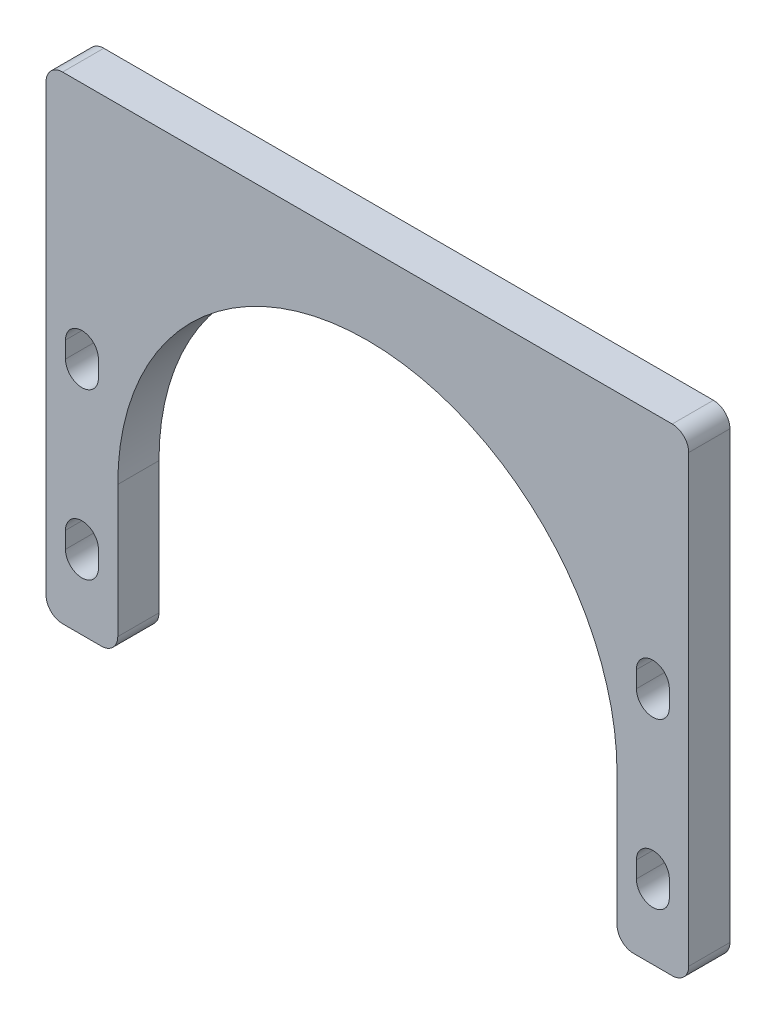
ISO-10303-21;
HEADER;
FILE_DESCRIPTION(('STEP AP214'),'2;1');
FILE_NAME('part.step','',(''),(''),'','','');
FILE_SCHEMA(('AUTOMOTIVE_DESIGN { 1 0 10303 214 1 1 1 1 }'));
ENDSEC;
DATA;
#1=APPLICATION_CONTEXT('core data for automotive mechanical design processes');
#2=APPLICATION_PROTOCOL_DEFINITION('international standard','automotive_design',2000,#1);
#3=PRODUCT_CONTEXT('',#1,'mechanical');
#4=PRODUCT('Part','Part','',(#3));
#5=PRODUCT_RELATED_PRODUCT_CATEGORY('part','',(#4));
#6=PRODUCT_DEFINITION_FORMATION('','',#4);
#7=PRODUCT_DEFINITION_CONTEXT('part definition',#1,'design');
#8=PRODUCT_DEFINITION('design','',#6,#7);
#9=PRODUCT_DEFINITION_SHAPE('','',#8);
#10=(LENGTH_UNIT() NAMED_UNIT(*) SI_UNIT(.MILLI.,.METRE.));
#11=(NAMED_UNIT(*) PLANE_ANGLE_UNIT() SI_UNIT($,.RADIAN.));
#12=(NAMED_UNIT(*) SI_UNIT($,.STERADIAN.) SOLID_ANGLE_UNIT());
#13=UNCERTAINTY_MEASURE_WITH_UNIT(LENGTH_MEASURE(1.E-05),#10,'distance_accuracy_value','');
#14=(GEOMETRIC_REPRESENTATION_CONTEXT(3) GLOBAL_UNCERTAINTY_ASSIGNED_CONTEXT((#13)) GLOBAL_UNIT_ASSIGNED_CONTEXT((#10,
#11,#12)) REPRESENTATION_CONTEXT('',''));
#15=CARTESIAN_POINT('',(0.,0.,0.));
#16=DIRECTION('',(0.,0.,1.));
#17=DIRECTION('',(1.,0.,0.));
#18=AXIS2_PLACEMENT_3D('',#15,#16,#17);
#19=CARTESIAN_POINT('',(0.,0.,5.));
#20=DIRECTION('',(0.,0.,1.));
#21=DIRECTION('',(1.,0.,0.));
#22=AXIS2_PLACEMENT_3D('',#19,#20,#21);
#23=PLANE('',#22);
#24=DIRECTION('',(0.,-1.,0.));
#25=VECTOR('',#24,1.);
#26=CARTESIAN_POINT('',(-36.65,10.,5.));
#27=LINE('',#26,#25);
#28=CARTESIAN_POINT('',(-36.65,12.,5.));
#29=VERTEX_POINT('',#28);
#30=CARTESIAN_POINT('',(-36.65,10.,5.));
#31=VERTEX_POINT('',#30);
#32=EDGE_CURVE('E444',#29,#31,#27,.T.);
#33=ORIENTED_EDGE('',*,*,#32,.F.);
#34=CARTESIAN_POINT('',(-34.65,12.,5.));
#35=DIRECTION('',(0.,0.,1.));
#36=DIRECTION('',(1.,0.,0.));
#37=AXIS2_PLACEMENT_3D('',#34,#35,#36);
#38=CIRCLE('',#37,2.);
#39=CARTESIAN_POINT('',(-32.65,12.,5.));
#40=VERTEX_POINT('',#39);
#41=EDGE_CURVE('E447',#40,#29,#38,.T.);
#42=ORIENTED_EDGE('',*,*,#41,.F.);
#43=DIRECTION('',(0.,1.,0.));
#44=VECTOR('',#43,1.);
#45=CARTESIAN_POINT('',(-32.65,10.,5.));
#46=LINE('',#45,#44);
#47=CARTESIAN_POINT('',(-32.65,10.,5.));
#48=VERTEX_POINT('',#47);
#49=EDGE_CURVE('E450',#48,#40,#46,.T.);
#50=ORIENTED_EDGE('',*,*,#49,.F.);
#51=CARTESIAN_POINT('',(-34.65,10.,5.));
#52=DIRECTION('',(0.,0.,1.));
#53=DIRECTION('',(1.,0.,0.));
#54=AXIS2_PLACEMENT_3D('',#51,#52,#53);
#55=CIRCLE('',#54,2.);
#56=EDGE_CURVE('E261',#31,#48,#55,.T.);
#57=ORIENTED_EDGE('',*,*,#56,.F.);
#58=EDGE_LOOP('',(#33,#42,#50,#57));
#59=FACE_BOUND('',#58,.T.);
#60=DIRECTION('',(0.,-1.,0.));
#61=VECTOR('',#60,1.);
#62=CARTESIAN_POINT('',(-36.65,-10.,5.));
#63=LINE('',#62,#61);
#64=CARTESIAN_POINT('',(-36.65,-8.,5.));
#65=VERTEX_POINT('',#64);
#66=CARTESIAN_POINT('',(-36.65,-10.,5.));
#67=VERTEX_POINT('',#66);
#68=EDGE_CURVE('E420',#65,#67,#63,.T.);
#69=ORIENTED_EDGE('',*,*,#68,.F.);
#70=CARTESIAN_POINT('',(-34.65,-8.,5.));
#71=DIRECTION('',(0.,0.,1.));
#72=DIRECTION('',(1.,0.,0.));
#73=AXIS2_PLACEMENT_3D('',#70,#71,#72);
#74=CIRCLE('',#73,2.);
#75=CARTESIAN_POINT('',(-32.65,-8.,5.));
#76=VERTEX_POINT('',#75);
#77=EDGE_CURVE('E423',#76,#65,#74,.T.);
#78=ORIENTED_EDGE('',*,*,#77,.F.);
#79=DIRECTION('',(0.,1.,0.));
#80=VECTOR('',#79,1.);
#81=CARTESIAN_POINT('',(-32.65,-10.,5.));
#82=LINE('',#81,#80);
#83=CARTESIAN_POINT('',(-32.65,-10.,5.));
#84=VERTEX_POINT('',#83);
#85=EDGE_CURVE('E426',#84,#76,#82,.T.);
#86=ORIENTED_EDGE('',*,*,#85,.F.);
#87=CARTESIAN_POINT('',(-34.65,-10.,5.));
#88=DIRECTION('',(0.,0.,1.));
#89=DIRECTION('',(1.,0.,0.));
#90=AXIS2_PLACEMENT_3D('',#87,#88,#89);
#91=CIRCLE('',#90,2.);
#92=EDGE_CURVE('E260',#84,#67,#91,.F.);
#93=ORIENTED_EDGE('',*,*,#92,.T.);
#94=EDGE_LOOP('',(#69,#78,#86,#93));
#95=FACE_BOUND('',#94,.T.);
#96=DIRECTION('',(-1.,0.,0.));
#97=VECTOR('',#96,1.);
#98=CARTESIAN_POINT('',(0.,-18.,5.));
#99=LINE('',#98,#97);
#100=CARTESIAN_POINT('',(-32.3,-18.,5.));
#101=VERTEX_POINT('',#100);
#102=CARTESIAN_POINT('',(-37.,-18.,5.));
#103=VERTEX_POINT('',#102);
#104=EDGE_CURVE('E398',#101,#103,#99,.T.);
#105=ORIENTED_EDGE('',*,*,#104,.F.);
#106=CARTESIAN_POINT('',(-32.3,-16.,5.));
#107=DIRECTION('',(0.,0.,1.));
#108=DIRECTION('',(1.,0.,0.));
#109=AXIS2_PLACEMENT_3D('',#106,#107,#108);
#110=CIRCLE('',#109,2.);
#111=CARTESIAN_POINT('',(-30.3,-16.,5.));
#112=VERTEX_POINT('',#111);
#113=EDGE_CURVE('E343',#101,#112,#110,.T.);
#114=ORIENTED_EDGE('',*,*,#113,.T.);
#115=DIRECTION('',(0.,-1.,0.));
#116=VECTOR('',#115,1.);
#117=CARTESIAN_POINT('',(-30.3,0.,5.));
#118=LINE('',#117,#116);
#119=CARTESIAN_POINT('',(-30.3,0.,5.));
#120=VERTEX_POINT('',#119);
#121=EDGE_CURVE('E267',#120,#112,#118,.T.);
#122=ORIENTED_EDGE('',*,*,#121,.F.);
#123=CARTESIAN_POINT('',(0.,0.,5.));
#124=DIRECTION('',(0.,0.,1.));
#125=DIRECTION('',(1.,0.,0.));
#126=AXIS2_PLACEMENT_3D('',#123,#124,#125);
#127=CIRCLE('',#126,30.3);
#128=CARTESIAN_POINT('',(30.3,0.,5.));
#129=VERTEX_POINT('',#128);
#130=EDGE_CURVE('E309',#129,#120,#127,.T.);
#131=ORIENTED_EDGE('',*,*,#130,.F.);
#132=DIRECTION('',(0.,-1.,0.));
#133=VECTOR('',#132,1.);
#134=CARTESIAN_POINT('',(30.3,0.,5.));
#135=LINE('',#134,#133);
#136=CARTESIAN_POINT('',(30.3,-16.,5.));
#137=VERTEX_POINT('',#136);
#138=EDGE_CURVE('E409',#129,#137,#135,.T.);
#139=ORIENTED_EDGE('',*,*,#138,.T.);
#140=CARTESIAN_POINT('',(32.3,-16.,5.));
#141=DIRECTION('',(0.,0.,1.));
#142=DIRECTION('',(1.,0.,0.));
#143=AXIS2_PLACEMENT_3D('',#140,#141,#142);
#144=CIRCLE('',#143,2.);
#145=CARTESIAN_POINT('',(32.3,-18.,5.));
#146=VERTEX_POINT('',#145);
#147=EDGE_CURVE('E339',#137,#146,#144,.T.);
#148=ORIENTED_EDGE('',*,*,#147,.T.);
#149=DIRECTION('',(1.,0.,0.));
#150=VECTOR('',#149,1.);
#151=CARTESIAN_POINT('',(0.,-18.,5.));
#152=LINE('',#151,#150);
#153=CARTESIAN_POINT('',(37.,-18.,5.));
#154=VERTEX_POINT('',#153);
#155=EDGE_CURVE('E406',#146,#154,#152,.T.);
#156=ORIENTED_EDGE('',*,*,#155,.T.);
#157=CARTESIAN_POINT('',(37.,-16.,5.));
#158=DIRECTION('',(0.,0.,1.));
#159=DIRECTION('',(1.,0.,0.));
#160=AXIS2_PLACEMENT_3D('',#157,#158,#159);
#161=CIRCLE('',#160,2.);
#162=CARTESIAN_POINT('',(39.,-16.,5.));
#163=VERTEX_POINT('',#162);
#164=EDGE_CURVE('E337',#154,#163,#161,.T.);
#165=ORIENTED_EDGE('',*,*,#164,.T.);
#166=DIRECTION('',(0.,-1.,0.));
#167=VECTOR('',#166,1.);
#168=CARTESIAN_POINT('',(39.,0.,5.));
#169=LINE('',#168,#167);
#170=CARTESIAN_POINT('',(39.,38.,5.));
#171=VERTEX_POINT('',#170);
#172=EDGE_CURVE('E379',#171,#163,#169,.T.);
#173=ORIENTED_EDGE('',*,*,#172,.F.);
#174=CARTESIAN_POINT('',(37.,38.,5.));
#175=DIRECTION('',(0.,0.,1.));
#176=DIRECTION('',(1.,0.,0.));
#177=AXIS2_PLACEMENT_3D('',#174,#175,#176);
#178=CIRCLE('',#177,2.);
#179=CARTESIAN_POINT('',(37.,40.,5.));
#180=VERTEX_POINT('',#179);
#181=EDGE_CURVE('E335',#171,#180,#178,.T.);
#182=ORIENTED_EDGE('',*,*,#181,.T.);
#183=DIRECTION('',(1.,0.,0.));
#184=VECTOR('',#183,1.);
#185=CARTESIAN_POINT('',(0.,40.,5.));
#186=LINE('',#185,#184);
#187=CARTESIAN_POINT('',(-37.,40.,5.));
#188=VERTEX_POINT('',#187);
#189=EDGE_CURVE('E367',#188,#180,#186,.T.);
#190=ORIENTED_EDGE('',*,*,#189,.F.);
#191=CARTESIAN_POINT('',(-37.,38.,5.));
#192=DIRECTION('',(0.,0.,1.));
#193=DIRECTION('',(1.,0.,0.));
#194=AXIS2_PLACEMENT_3D('',#191,#192,#193);
#195=CIRCLE('',#194,2.);
#196=CARTESIAN_POINT('',(-39.,38.,5.));
#197=VERTEX_POINT('',#196);
#198=EDGE_CURVE('E333',#188,#197,#195,.T.);
#199=ORIENTED_EDGE('',*,*,#198,.T.);
#200=DIRECTION('',(0.,-1.,0.));
#201=VECTOR('',#200,1.);
#202=CARTESIAN_POINT('',(-39.,0.,5.));
#203=LINE('',#202,#201);
#204=CARTESIAN_POINT('',(-39.,-16.,5.));
#205=VERTEX_POINT('',#204);
#206=EDGE_CURVE('E378',#197,#205,#203,.T.);
#207=ORIENTED_EDGE('',*,*,#206,.T.);
#208=CARTESIAN_POINT('',(-37.,-16.,5.));
#209=DIRECTION('',(0.,0.,1.));
#210=DIRECTION('',(1.,0.,0.));
#211=AXIS2_PLACEMENT_3D('',#208,#209,#210);
#212=CIRCLE('',#211,2.);
#213=EDGE_CURVE('E341',#205,#103,#212,.T.);
#214=ORIENTED_EDGE('',*,*,#213,.T.);
#215=EDGE_LOOP('',(#105,#114,#122,#131,#139,#148,#156,#165,#173,#182,#190,#199,#207,#214));
#216=FACE_BOUND('',#215,.T.);
#217=CARTESIAN_POINT('',(34.65,-9.99999999999994,5.));
#218=DIRECTION('',(0.,0.,1.));
#219=DIRECTION('',(1.,0.,0.));
#220=AXIS2_PLACEMENT_3D('',#217,#218,#219);
#221=CIRCLE('',#220,2.);
#222=CARTESIAN_POINT('',(32.65,-10.,5.));
#223=VERTEX_POINT('',#222);
#224=CARTESIAN_POINT('',(36.65,-10.,5.));
#225=VERTEX_POINT('',#224);
#226=EDGE_CURVE('E264',#223,#225,#221,.T.);
#227=ORIENTED_EDGE('',*,*,#226,.F.);
#228=DIRECTION('',(0.,1.,0.));
#229=VECTOR('',#228,1.);
#230=CARTESIAN_POINT('',(32.65,-10.,5.));
#231=LINE('',#230,#229);
#232=CARTESIAN_POINT('',(32.65,-8.,5.));
#233=VERTEX_POINT('',#232);
#234=EDGE_CURVE('E467',#223,#233,#231,.T.);
#235=ORIENTED_EDGE('',*,*,#234,.T.);
#236=CARTESIAN_POINT('',(34.65,-8.,5.));
#237=DIRECTION('',(0.,0.,-1.));
#238=DIRECTION('',(-1.,0.,0.));
#239=AXIS2_PLACEMENT_3D('',#236,#237,#238);
#240=CIRCLE('',#239,2.);
#241=CARTESIAN_POINT('',(36.65,-8.,5.));
#242=VERTEX_POINT('',#241);
#243=EDGE_CURVE('E471',#233,#242,#240,.T.);
#244=ORIENTED_EDGE('',*,*,#243,.T.);
#245=DIRECTION('',(0.,-1.,0.));
#246=VECTOR('',#245,1.);
#247=CARTESIAN_POINT('',(36.65,-10.,5.));
#248=LINE('',#247,#246);
#249=EDGE_CURVE('E474',#242,#225,#248,.T.);
#250=ORIENTED_EDGE('',*,*,#249,.T.);
#251=EDGE_LOOP('',(#227,#235,#244,#250));
#252=FACE_BOUND('',#251,.T.);
#253=CARTESIAN_POINT('',(34.65,10.,5.));
#254=DIRECTION('',(0.,0.,1.));
#255=DIRECTION('',(1.,0.,0.));
#256=AXIS2_PLACEMENT_3D('',#253,#254,#255);
#257=CIRCLE('',#256,2.);
#258=CARTESIAN_POINT('',(36.65,10.,5.));
#259=VERTEX_POINT('',#258);
#260=CARTESIAN_POINT('',(32.65,10.,5.));
#261=VERTEX_POINT('',#260);
#262=EDGE_CURVE('E252',#259,#261,#257,.F.);
#263=ORIENTED_EDGE('',*,*,#262,.T.);
#264=DIRECTION('',(0.,1.,0.));
#265=VECTOR('',#264,1.);
#266=CARTESIAN_POINT('',(32.65,10.,5.));
#267=LINE('',#266,#265);
#268=CARTESIAN_POINT('',(32.65,12.,5.));
#269=VERTEX_POINT('',#268);
#270=EDGE_CURVE('E233',#261,#269,#267,.T.);
#271=ORIENTED_EDGE('',*,*,#270,.T.);
#272=CARTESIAN_POINT('',(34.65,12.,5.));
#273=DIRECTION('',(0.,0.,-1.));
#274=DIRECTION('',(-1.,0.,0.));
#275=AXIS2_PLACEMENT_3D('',#272,#273,#274);
#276=CIRCLE('',#275,2.);
#277=CARTESIAN_POINT('',(36.65,12.,5.));
#278=VERTEX_POINT('',#277);
#279=EDGE_CURVE('E245',#269,#278,#276,.T.);
#280=ORIENTED_EDGE('',*,*,#279,.T.);
#281=DIRECTION('',(0.,-1.,0.));
#282=VECTOR('',#281,1.);
#283=CARTESIAN_POINT('',(36.65,10.,5.));
#284=LINE('',#283,#282);
#285=EDGE_CURVE('E259',#278,#259,#284,.T.);
#286=ORIENTED_EDGE('',*,*,#285,.T.);
#287=EDGE_LOOP('',(#263,#271,#280,#286));
#288=FACE_BOUND('',#287,.T.);
#289=ADVANCED_FACE('F37',(#59,#95,#216,#252,#288),#23,.T.);
#290=CARTESIAN_POINT('',(0.,0.,0.));
#291=DIRECTION('',(0.,0.,1.));
#292=DIRECTION('',(1.,0.,0.));
#293=AXIS2_PLACEMENT_3D('',#290,#291,#292);
#294=PLANE('',#293);
#295=DIRECTION('',(0.,-1.,0.));
#296=VECTOR('',#295,1.);
#297=CARTESIAN_POINT('',(32.65,-10.,0.));
#298=LINE('',#297,#296);
#299=CARTESIAN_POINT('',(32.65,-8.,0.));
#300=VERTEX_POINT('',#299);
#301=CARTESIAN_POINT('',(32.65,-9.99999999999994,0.));
#302=VERTEX_POINT('',#301);
#303=EDGE_CURVE('E477',#300,#302,#298,.T.);
#304=ORIENTED_EDGE('',*,*,#303,.T.);
#305=CARTESIAN_POINT('',(34.65,-9.99999999999994,0.));
#306=DIRECTION('',(0.,0.,1.));
#307=DIRECTION('',(1.,0.,0.));
#308=AXIS2_PLACEMENT_3D('',#305,#306,#307);
#309=CIRCLE('',#308,2.);
#310=CARTESIAN_POINT('',(36.65,-9.99999999999994,0.));
#311=VERTEX_POINT('',#310);
#312=EDGE_CURVE('E306',#302,#311,#309,.T.);
#313=ORIENTED_EDGE('',*,*,#312,.T.);
#314=DIRECTION('',(0.,1.,0.));
#315=VECTOR('',#314,1.);
#316=CARTESIAN_POINT('',(36.65,-10.,0.));
#317=LINE('',#316,#315);
#318=CARTESIAN_POINT('',(36.65,-8.,0.));
#319=VERTEX_POINT('',#318);
#320=EDGE_CURVE('E462',#311,#319,#317,.T.);
#321=ORIENTED_EDGE('',*,*,#320,.T.);
#322=CARTESIAN_POINT('',(34.65,-8.,0.));
#323=DIRECTION('',(0.,0.,1.));
#324=DIRECTION('',(1.,0.,0.));
#325=AXIS2_PLACEMENT_3D('',#322,#323,#324);
#326=CIRCLE('',#325,2.);
#327=EDGE_CURVE('E480',#319,#300,#326,.T.);
#328=ORIENTED_EDGE('',*,*,#327,.T.);
#329=EDGE_LOOP('',(#304,#313,#321,#328));
#330=FACE_BOUND('',#329,.T.);
#331=DIRECTION('',(0.,-1.,0.));
#332=VECTOR('',#331,1.);
#333=CARTESIAN_POINT('',(-30.3,0.,0.));
#334=LINE('',#333,#332);
#335=CARTESIAN_POINT('',(-30.3,0.,0.));
#336=VERTEX_POINT('',#335);
#337=CARTESIAN_POINT('',(-30.3,-16.,0.));
#338=VERTEX_POINT('',#337);
#339=EDGE_CURVE('E296',#336,#338,#334,.T.);
#340=ORIENTED_EDGE('',*,*,#339,.T.);
#341=CARTESIAN_POINT('',(-32.3,-16.,0.));
#342=DIRECTION('',(0.,0.,1.));
#343=DIRECTION('',(1.,0.,0.));
#344=AXIS2_PLACEMENT_3D('',#341,#342,#343);
#345=CIRCLE('',#344,2.);
#346=CARTESIAN_POINT('',(-32.3,-18.,0.));
#347=VERTEX_POINT('',#346);
#348=EDGE_CURVE('E326',#338,#347,#345,.F.);
#349=ORIENTED_EDGE('',*,*,#348,.T.);
#350=DIRECTION('',(-1.,0.,0.));
#351=VECTOR('',#350,1.);
#352=CARTESIAN_POINT('',(0.,-18.,0.));
#353=LINE('',#352,#351);
#354=CARTESIAN_POINT('',(-37.,-18.,0.));
#355=VERTEX_POINT('',#354);
#356=EDGE_CURVE('E293',#347,#355,#353,.T.);
#357=ORIENTED_EDGE('',*,*,#356,.T.);
#358=CARTESIAN_POINT('',(-37.,-16.,0.));
#359=DIRECTION('',(0.,0.,1.));
#360=DIRECTION('',(1.,0.,0.));
#361=AXIS2_PLACEMENT_3D('',#358,#359,#360);
#362=CIRCLE('',#361,2.);
#363=CARTESIAN_POINT('',(-39.,-16.,0.));
#364=VERTEX_POINT('',#363);
#365=EDGE_CURVE('E324',#355,#364,#362,.F.);
#366=ORIENTED_EDGE('',*,*,#365,.T.);
#367=DIRECTION('',(0.,-1.,0.));
#368=VECTOR('',#367,1.);
#369=CARTESIAN_POINT('',(-39.,0.,0.));
#370=LINE('',#369,#368);
#371=CARTESIAN_POINT('',(-39.,38.,0.));
#372=VERTEX_POINT('',#371);
#373=EDGE_CURVE('E290',#372,#364,#370,.T.);
#374=ORIENTED_EDGE('',*,*,#373,.F.);
#375=CARTESIAN_POINT('',(-37.,38.,0.));
#376=DIRECTION('',(0.,0.,1.));
#377=DIRECTION('',(1.,0.,0.));
#378=AXIS2_PLACEMENT_3D('',#375,#376,#377);
#379=CIRCLE('',#378,2.);
#380=CARTESIAN_POINT('',(-37.,40.,0.));
#381=VERTEX_POINT('',#380);
#382=EDGE_CURVE('E316',#372,#381,#379,.F.);
#383=ORIENTED_EDGE('',*,*,#382,.T.);
#384=DIRECTION('',(1.,0.,0.));
#385=VECTOR('',#384,1.);
#386=CARTESIAN_POINT('',(0.,40.,0.));
#387=LINE('',#386,#385);
#388=CARTESIAN_POINT('',(37.,40.,0.));
#389=VERTEX_POINT('',#388);
#390=EDGE_CURVE('E287',#381,#389,#387,.T.);
#391=ORIENTED_EDGE('',*,*,#390,.T.);
#392=CARTESIAN_POINT('',(37.,38.,0.));
#393=DIRECTION('',(0.,0.,1.));
#394=DIRECTION('',(1.,0.,0.));
#395=AXIS2_PLACEMENT_3D('',#392,#393,#394);
#396=CIRCLE('',#395,2.);
#397=CARTESIAN_POINT('',(39.,38.,0.));
#398=VERTEX_POINT('',#397);
#399=EDGE_CURVE('E318',#389,#398,#396,.F.);
#400=ORIENTED_EDGE('',*,*,#399,.T.);
#401=DIRECTION('',(0.,-1.,0.));
#402=VECTOR('',#401,1.);
#403=CARTESIAN_POINT('',(39.,0.,0.));
#404=LINE('',#403,#402);
#405=CARTESIAN_POINT('',(39.,-16.,0.));
#406=VERTEX_POINT('',#405);
#407=EDGE_CURVE('E284',#398,#406,#404,.T.);
#408=ORIENTED_EDGE('',*,*,#407,.T.);
#409=CARTESIAN_POINT('',(37.,-16.,0.));
#410=DIRECTION('',(0.,0.,1.));
#411=DIRECTION('',(1.,0.,0.));
#412=AXIS2_PLACEMENT_3D('',#409,#410,#411);
#413=CIRCLE('',#412,2.);
#414=CARTESIAN_POINT('',(37.,-18.,0.));
#415=VERTEX_POINT('',#414);
#416=EDGE_CURVE('E320',#406,#415,#413,.F.);
#417=ORIENTED_EDGE('',*,*,#416,.T.);
#418=DIRECTION('',(1.,0.,0.));
#419=VECTOR('',#418,1.);
#420=CARTESIAN_POINT('',(0.,-18.,0.));
#421=LINE('',#420,#419);
#422=CARTESIAN_POINT('',(32.3,-18.,0.));
#423=VERTEX_POINT('',#422);
#424=EDGE_CURVE('E281',#423,#415,#421,.T.);
#425=ORIENTED_EDGE('',*,*,#424,.F.);
#426=CARTESIAN_POINT('',(32.3,-16.,0.));
#427=DIRECTION('',(0.,0.,1.));
#428=DIRECTION('',(1.,0.,0.));
#429=AXIS2_PLACEMENT_3D('',#426,#427,#428);
#430=CIRCLE('',#429,2.);
#431=CARTESIAN_POINT('',(30.3,-16.,0.));
#432=VERTEX_POINT('',#431);
#433=EDGE_CURVE('E322',#423,#432,#430,.F.);
#434=ORIENTED_EDGE('',*,*,#433,.T.);
#435=DIRECTION('',(0.,-1.,0.));
#436=VECTOR('',#435,1.);
#437=CARTESIAN_POINT('',(30.3,0.,0.));
#438=LINE('',#437,#436);
#439=CARTESIAN_POINT('',(30.3,0.,0.));
#440=VERTEX_POINT('',#439);
#441=EDGE_CURVE('E277',#440,#432,#438,.T.);
#442=ORIENTED_EDGE('',*,*,#441,.F.);
#443=CARTESIAN_POINT('',(0.,0.,0.));
#444=DIRECTION('',(0.,0.,1.));
#445=DIRECTION('',(1.,0.,0.));
#446=AXIS2_PLACEMENT_3D('',#443,#444,#445);
#447=CIRCLE('',#446,30.3);
#448=EDGE_CURVE('E274',#440,#336,#447,.T.);
#449=ORIENTED_EDGE('',*,*,#448,.T.);
#450=EDGE_LOOP('',(#340,#349,#357,#366,#374,#383,#391,#400,#408,#417,#425,#434,#442,#449));
#451=FACE_BOUND('',#450,.T.);
#452=CARTESIAN_POINT('',(-34.65,12.,0.));
#453=DIRECTION('',(0.,0.,1.));
#454=DIRECTION('',(1.,0.,0.));
#455=AXIS2_PLACEMENT_3D('',#452,#453,#454);
#456=CIRCLE('',#455,2.);
#457=CARTESIAN_POINT('',(-36.65,12.,0.));
#458=VERTEX_POINT('',#457);
#459=CARTESIAN_POINT('',(-32.65,12.,0.));
#460=VERTEX_POINT('',#459);
#461=EDGE_CURVE('E455',#458,#460,#456,.F.);
#462=ORIENTED_EDGE('',*,*,#461,.F.);
#463=DIRECTION('',(0.,1.,0.));
#464=VECTOR('',#463,1.);
#465=CARTESIAN_POINT('',(-36.65,10.,0.));
#466=LINE('',#465,#464);
#467=CARTESIAN_POINT('',(-36.65,10.,0.));
#468=VERTEX_POINT('',#467);
#469=EDGE_CURVE('E453',#468,#458,#466,.T.);
#470=ORIENTED_EDGE('',*,*,#469,.F.);
#471=CARTESIAN_POINT('',(-34.65,10.,0.));
#472=DIRECTION('',(0.,0.,1.));
#473=DIRECTION('',(1.,0.,0.));
#474=AXIS2_PLACEMENT_3D('',#471,#472,#473);
#475=CIRCLE('',#474,2.);
#476=CARTESIAN_POINT('',(-32.65,10.,0.));
#477=VERTEX_POINT('',#476);
#478=EDGE_CURVE('E299',#468,#477,#475,.T.);
#479=ORIENTED_EDGE('',*,*,#478,.T.);
#480=DIRECTION('',(0.,-1.,0.));
#481=VECTOR('',#480,1.);
#482=CARTESIAN_POINT('',(-32.65,10.,0.));
#483=LINE('',#482,#481);
#484=EDGE_CURVE('E278',#460,#477,#483,.T.);
#485=ORIENTED_EDGE('',*,*,#484,.F.);
#486=EDGE_LOOP('',(#462,#470,#479,#485));
#487=FACE_BOUND('',#486,.T.);
#488=CARTESIAN_POINT('',(-34.65,-8.,0.));
#489=DIRECTION('',(0.,0.,1.));
#490=DIRECTION('',(1.,0.,0.));
#491=AXIS2_PLACEMENT_3D('',#488,#489,#490);
#492=CIRCLE('',#491,2.);
#493=CARTESIAN_POINT('',(-36.65,-8.,0.));
#494=VERTEX_POINT('',#493);
#495=CARTESIAN_POINT('',(-32.65,-8.,0.));
#496=VERTEX_POINT('',#495);
#497=EDGE_CURVE('E432',#494,#496,#492,.F.);
#498=ORIENTED_EDGE('',*,*,#497,.F.);
#499=DIRECTION('',(0.,1.,0.));
#500=VECTOR('',#499,1.);
#501=CARTESIAN_POINT('',(-36.65,-10.,0.));
#502=LINE('',#501,#500);
#503=CARTESIAN_POINT('',(-36.65,-10.,0.));
#504=VERTEX_POINT('',#503);
#505=EDGE_CURVE('E429',#504,#494,#502,.T.);
#506=ORIENTED_EDGE('',*,*,#505,.F.);
#507=CARTESIAN_POINT('',(-34.65,-10.,0.));
#508=DIRECTION('',(0.,0.,1.));
#509=DIRECTION('',(1.,0.,0.));
#510=AXIS2_PLACEMENT_3D('',#507,#508,#509);
#511=CIRCLE('',#510,2.);
#512=CARTESIAN_POINT('',(-32.65,-10.,0.));
#513=VERTEX_POINT('',#512);
#514=EDGE_CURVE('E303',#513,#504,#511,.F.);
#515=ORIENTED_EDGE('',*,*,#514,.F.);
#516=DIRECTION('',(0.,-1.,0.));
#517=VECTOR('',#516,1.);
#518=CARTESIAN_POINT('',(-32.65,-10.,0.));
#519=LINE('',#518,#517);
#520=EDGE_CURVE('E414',#496,#513,#519,.T.);
#521=ORIENTED_EDGE('',*,*,#520,.F.);
#522=EDGE_LOOP('',(#498,#506,#515,#521));
#523=FACE_BOUND('',#522,.T.);
#524=DIRECTION('',(0.,-1.,0.));
#525=VECTOR('',#524,1.);
#526=CARTESIAN_POINT('',(32.65,10.,0.));
#527=LINE('',#526,#525);
#528=CARTESIAN_POINT('',(32.65,12.,0.));
#529=VERTEX_POINT('',#528);
#530=CARTESIAN_POINT('',(32.65,10.,0.));
#531=VERTEX_POINT('',#530);
#532=EDGE_CURVE('E494',#529,#531,#527,.T.);
#533=ORIENTED_EDGE('',*,*,#532,.T.);
#534=CARTESIAN_POINT('',(34.65,10.,0.));
#535=DIRECTION('',(0.,0.,1.));
#536=DIRECTION('',(1.,0.,0.));
#537=AXIS2_PLACEMENT_3D('',#534,#535,#536);
#538=CIRCLE('',#537,2.);
#539=CARTESIAN_POINT('',(36.65,10.,0.));
#540=VERTEX_POINT('',#539);
#541=EDGE_CURVE('E254',#540,#531,#538,.F.);
#542=ORIENTED_EDGE('',*,*,#541,.F.);
#543=DIRECTION('',(0.,1.,0.));
#544=VECTOR('',#543,1.);
#545=CARTESIAN_POINT('',(36.65,10.,0.));
#546=LINE('',#545,#544);
#547=CARTESIAN_POINT('',(36.65,12.,0.));
#548=VERTEX_POINT('',#547);
#549=EDGE_CURVE('E439',#540,#548,#546,.T.);
#550=ORIENTED_EDGE('',*,*,#549,.T.);
#551=CARTESIAN_POINT('',(34.65,12.,0.));
#552=DIRECTION('',(0.,0.,1.));
#553=DIRECTION('',(1.,0.,0.));
#554=AXIS2_PLACEMENT_3D('',#551,#552,#553);
#555=CIRCLE('',#554,2.);
#556=EDGE_CURVE('E52',#548,#529,#555,.T.);
#557=ORIENTED_EDGE('',*,*,#556,.T.);
#558=EDGE_LOOP('',(#533,#542,#550,#557));
#559=FACE_BOUND('',#558,.T.);
#560=ADVANCED_FACE('F387',(#330,#451,#487,#523,#559),#294,.F.);
#561=CARTESIAN_POINT('',(0.,0.,5.));
#562=DIRECTION('',(0.,0.,-1.));
#563=DIRECTION('',(-1.,0.,0.));
#564=AXIS2_PLACEMENT_3D('',#561,#562,#563);
#565=CYLINDRICAL_SURFACE('',#564,30.3);
#566=ORIENTED_EDGE('',*,*,#448,.F.);
#567=DIRECTION('',(0.,0.,-1.));
#568=VECTOR('',#567,1.);
#569=CARTESIAN_POINT('',(30.3,0.,5.));
#570=LINE('',#569,#568);
#571=EDGE_CURVE('E311',#129,#440,#570,.T.);
#572=ORIENTED_EDGE('',*,*,#571,.F.);
#573=ORIENTED_EDGE('',*,*,#130,.T.);
#574=DIRECTION('',(0.,0.,-1.));
#575=VECTOR('',#574,1.);
#576=CARTESIAN_POINT('',(-30.3,0.,5.));
#577=LINE('',#576,#575);
#578=EDGE_CURVE('E273',#120,#336,#577,.T.);
#579=ORIENTED_EDGE('',*,*,#578,.T.);
#580=EDGE_LOOP('',(#566,#572,#573,#579));
#581=FACE_BOUND('',#580,.T.);
#582=ADVANCED_FACE('F517',(#581),#565,.F.);
#583=CARTESIAN_POINT('',(30.3,0.,5.));
#584=DIRECTION('',(1.,0.,0.));
#585=DIRECTION('',(0.,1.,0.));
#586=AXIS2_PLACEMENT_3D('',#583,#584,#585);
#587=PLANE('',#586);
#588=ORIENTED_EDGE('',*,*,#441,.T.);
#589=DIRECTION('',(0.,0.,-1.));
#590=VECTOR('',#589,1.);
#591=CARTESIAN_POINT('',(30.3,-16.,5.));
#592=LINE('',#591,#590);
#593=EDGE_CURVE('E355',#432,#137,#592,.F.);
#594=ORIENTED_EDGE('',*,*,#593,.T.);
#595=ORIENTED_EDGE('',*,*,#138,.F.);
#596=ORIENTED_EDGE('',*,*,#571,.T.);
#597=EDGE_LOOP('',(#588,#594,#595,#596));
#598=FACE_BOUND('',#597,.T.);
#599=ADVANCED_FACE('F558',(#598),#587,.F.);
#600=CARTESIAN_POINT('',(0.,-18.,5.));
#601=DIRECTION('',(0.,1.,0.));
#602=DIRECTION('',(-1.,0.,0.));
#603=AXIS2_PLACEMENT_3D('',#600,#601,#602);
#604=PLANE('',#603);
#605=ORIENTED_EDGE('',*,*,#155,.F.);
#606=DIRECTION('',(0.,0.,-1.));
#607=VECTOR('',#606,1.);
#608=CARTESIAN_POINT('',(32.3,-18.,5.));
#609=LINE('',#608,#607);
#610=EDGE_CURVE('E352',#146,#423,#609,.T.);
#611=ORIENTED_EDGE('',*,*,#610,.T.);
#612=ORIENTED_EDGE('',*,*,#424,.T.);
#613=DIRECTION('',(0.,0.,-1.));
#614=VECTOR('',#613,1.);
#615=CARTESIAN_POINT('',(37.,-18.,5.));
#616=LINE('',#615,#614);
#617=EDGE_CURVE('E350',#415,#154,#616,.F.);
#618=ORIENTED_EDGE('',*,*,#617,.T.);
#619=EDGE_LOOP('',(#605,#611,#612,#618));
#620=FACE_BOUND('',#619,.T.);
#621=ADVANCED_FACE('F554',(#620),#604,.F.);
#622=CARTESIAN_POINT('',(39.,0.,5.));
#623=DIRECTION('',(1.,0.,0.));
#624=DIRECTION('',(0.,1.,0.));
#625=AXIS2_PLACEMENT_3D('',#622,#623,#624);
#626=PLANE('',#625);
#627=ORIENTED_EDGE('',*,*,#172,.T.);
#628=DIRECTION('',(0.,0.,-1.));
#629=VECTOR('',#628,1.);
#630=CARTESIAN_POINT('',(39.,-16.,0.));
#631=LINE('',#630,#629);
#632=EDGE_CURVE('E359',#163,#406,#631,.T.);
#633=ORIENTED_EDGE('',*,*,#632,.T.);
#634=ORIENTED_EDGE('',*,*,#407,.F.);
#635=DIRECTION('',(0.,0.,-1.));
#636=VECTOR('',#635,1.);
#637=CARTESIAN_POINT('',(39.,38.,5.));
#638=LINE('',#637,#636);
#639=EDGE_CURVE('E357',#398,#171,#638,.F.);
#640=ORIENTED_EDGE('',*,*,#639,.T.);
#641=EDGE_LOOP('',(#627,#633,#634,#640));
#642=FACE_BOUND('',#641,.T.);
#643=ADVANCED_FACE('F551',(#642),#626,.T.);
#644=CARTESIAN_POINT('',(0.,40.,5.));
#645=DIRECTION('',(0.,1.,0.));
#646=DIRECTION('',(-1.,0.,0.));
#647=AXIS2_PLACEMENT_3D('',#644,#645,#646);
#648=PLANE('',#647);
#649=ORIENTED_EDGE('',*,*,#189,.T.);
#650=DIRECTION('',(0.,0.,-1.));
#651=VECTOR('',#650,1.);
#652=CARTESIAN_POINT('',(37.,40.,5.));
#653=LINE('',#652,#651);
#654=EDGE_CURVE('E11',#180,#389,#653,.T.);
#655=ORIENTED_EDGE('',*,*,#654,.T.);
#656=ORIENTED_EDGE('',*,*,#390,.F.);
#657=DIRECTION('',(0.,0.,-1.));
#658=VECTOR('',#657,1.);
#659=CARTESIAN_POINT('',(-37.,40.,5.));
#660=LINE('',#659,#658);
#661=EDGE_CURVE('E45',#381,#188,#660,.F.);
#662=ORIENTED_EDGE('',*,*,#661,.T.);
#663=EDGE_LOOP('',(#649,#655,#656,#662));
#664=FACE_BOUND('',#663,.T.);
#665=ADVANCED_FACE('F366',(#664),#648,.T.);
#666=CARTESIAN_POINT('',(-39.,0.,5.));
#667=DIRECTION('',(1.,0.,0.));
#668=DIRECTION('',(0.,1.,0.));
#669=AXIS2_PLACEMENT_3D('',#666,#667,#668);
#670=PLANE('',#669);
#671=ORIENTED_EDGE('',*,*,#373,.T.);
#672=DIRECTION('',(0.,0.,-1.));
#673=VECTOR('',#672,1.);
#674=CARTESIAN_POINT('',(-39.,-16.,5.));
#675=LINE('',#674,#673);
#676=EDGE_CURVE('E348',#364,#205,#675,.F.);
#677=ORIENTED_EDGE('',*,*,#676,.T.);
#678=ORIENTED_EDGE('',*,*,#206,.F.);
#679=DIRECTION('',(0.,0.,-1.));
#680=VECTOR('',#679,1.);
#681=CARTESIAN_POINT('',(-39.,38.,0.));
#682=LINE('',#681,#680);
#683=EDGE_CURVE('E345',#197,#372,#682,.T.);
#684=ORIENTED_EDGE('',*,*,#683,.T.);
#685=EDGE_LOOP('',(#671,#677,#678,#684));
#686=FACE_BOUND('',#685,.T.);
#687=ADVANCED_FACE('F384',(#686),#670,.F.);
#688=CARTESIAN_POINT('',(0.,-18.,5.));
#689=DIRECTION('',(0.,-1.,0.));
#690=DIRECTION('',(0.,0.,-1.));
#691=AXIS2_PLACEMENT_3D('',#688,#689,#690);
#692=PLANE('',#691);
#693=ORIENTED_EDGE('',*,*,#356,.F.);
#694=DIRECTION('',(0.,0.,-1.));
#695=VECTOR('',#694,1.);
#696=CARTESIAN_POINT('',(-32.3,-18.,5.));
#697=LINE('',#696,#695);
#698=EDGE_CURVE('E331',#347,#101,#697,.F.);
#699=ORIENTED_EDGE('',*,*,#698,.T.);
#700=ORIENTED_EDGE('',*,*,#104,.T.);
#701=DIRECTION('',(0.,0.,-1.));
#702=VECTOR('',#701,1.);
#703=CARTESIAN_POINT('',(-37.,-18.,0.));
#704=LINE('',#703,#702);
#705=EDGE_CURVE('E328',#103,#355,#704,.T.);
#706=ORIENTED_EDGE('',*,*,#705,.T.);
#707=EDGE_LOOP('',(#693,#699,#700,#706));
#708=FACE_BOUND('',#707,.T.);
#709=ADVANCED_FACE('F396',(#708),#692,.T.);
#710=CARTESIAN_POINT('',(-34.65,-10.,5.));
#711=DIRECTION('',(0.,0.,-1.));
#712=DIRECTION('',(-1.,0.,0.));
#713=AXIS2_PLACEMENT_3D('',#710,#711,#712);
#714=CYLINDRICAL_SURFACE('',#713,2.);
#715=ORIENTED_EDGE('',*,*,#514,.T.);
#716=DIRECTION('',(0.,0.,-1.));
#717=VECTOR('',#716,1.);
#718=CARTESIAN_POINT('',(-36.65,-10.,5.));
#719=LINE('',#718,#717);
#720=EDGE_CURVE('E434',#67,#504,#719,.T.);
#721=ORIENTED_EDGE('',*,*,#720,.F.);
#722=ORIENTED_EDGE('',*,*,#92,.F.);
#723=DIRECTION('',(0.,0.,-1.));
#724=VECTOR('',#723,1.);
#725=CARTESIAN_POINT('',(-32.65,-10.,5.));
#726=LINE('',#725,#724);
#727=EDGE_CURVE('E436',#84,#513,#726,.T.);
#728=ORIENTED_EDGE('',*,*,#727,.T.);
#729=EDGE_LOOP('',(#715,#721,#722,#728));
#730=FACE_BOUND('',#729,.T.);
#731=ADVANCED_FACE('F532',(#730),#714,.F.);
#732=CARTESIAN_POINT('',(34.65,10.,5.));
#733=DIRECTION('',(0.,0.,-1.));
#734=DIRECTION('',(-1.,0.,0.));
#735=AXIS2_PLACEMENT_3D('',#732,#733,#734);
#736=CYLINDRICAL_SURFACE('',#735,2.);
#737=ORIENTED_EDGE('',*,*,#541,.T.);
#738=DIRECTION('',(0.,0.,-1.));
#739=VECTOR('',#738,1.);
#740=CARTESIAN_POINT('',(32.65,10.,5.));
#741=LINE('',#740,#739);
#742=EDGE_CURVE('E237',#261,#531,#741,.T.);
#743=ORIENTED_EDGE('',*,*,#742,.F.);
#744=ORIENTED_EDGE('',*,*,#262,.F.);
#745=DIRECTION('',(0.,0.,-1.));
#746=VECTOR('',#745,1.);
#747=CARTESIAN_POINT('',(36.65,10.,5.));
#748=LINE('',#747,#746);
#749=EDGE_CURVE('E255',#259,#540,#748,.T.);
#750=ORIENTED_EDGE('',*,*,#749,.T.);
#751=EDGE_LOOP('',(#737,#743,#744,#750));
#752=FACE_BOUND('',#751,.T.);
#753=ADVANCED_FACE('F250',(#752),#736,.F.);
#754=CARTESIAN_POINT('',(-34.65,10.,5.));
#755=DIRECTION('',(0.,0.,-1.));
#756=DIRECTION('',(-1.,0.,0.));
#757=AXIS2_PLACEMENT_3D('',#754,#755,#756);
#758=CYLINDRICAL_SURFACE('',#757,2.);
#759=DIRECTION('',(0.,0.,-1.));
#760=VECTOR('',#759,1.);
#761=CARTESIAN_POINT('',(-36.65,10.,5.));
#762=LINE('',#761,#760);
#763=EDGE_CURVE('E458',#468,#31,#762,.F.);
#764=ORIENTED_EDGE('',*,*,#763,.T.);
#765=ORIENTED_EDGE('',*,*,#56,.T.);
#766=DIRECTION('',(0.,0.,-1.));
#767=VECTOR('',#766,1.);
#768=CARTESIAN_POINT('',(-32.65,10.,5.));
#769=LINE('',#768,#767);
#770=EDGE_CURVE('E416',#477,#48,#769,.F.);
#771=ORIENTED_EDGE('',*,*,#770,.F.);
#772=ORIENTED_EDGE('',*,*,#478,.F.);
#773=EDGE_LOOP('',(#764,#765,#771,#772));
#774=FACE_BOUND('',#773,.T.);
#775=ADVANCED_FACE('F538',(#774),#758,.F.);
#776=CARTESIAN_POINT('',(-30.3,0.,5.));
#777=DIRECTION('',(1.,0.,0.));
#778=DIRECTION('',(0.,1.,0.));
#779=AXIS2_PLACEMENT_3D('',#776,#777,#778);
#780=PLANE('',#779);
#781=ORIENTED_EDGE('',*,*,#121,.T.);
#782=DIRECTION('',(0.,0.,-1.));
#783=VECTOR('',#782,1.);
#784=CARTESIAN_POINT('',(-30.3,-16.,5.));
#785=LINE('',#784,#783);
#786=EDGE_CURVE('E313',#112,#338,#785,.T.);
#787=ORIENTED_EDGE('',*,*,#786,.T.);
#788=ORIENTED_EDGE('',*,*,#339,.F.);
#789=ORIENTED_EDGE('',*,*,#578,.F.);
#790=EDGE_LOOP('',(#781,#787,#788,#789));
#791=FACE_BOUND('',#790,.T.);
#792=ADVANCED_FACE('F530',(#791),#780,.T.);
#793=CARTESIAN_POINT('',(34.65,-9.99999999999994,5.));
#794=DIRECTION('',(0.,0.,-1.));
#795=DIRECTION('',(-1.,0.,0.));
#796=AXIS2_PLACEMENT_3D('',#793,#794,#795);
#797=CYLINDRICAL_SURFACE('',#796,2.);
#798=DIRECTION('',(0.,0.,-1.));
#799=VECTOR('',#798,1.);
#800=CARTESIAN_POINT('',(32.65,-9.99999999999994,5.));
#801=LINE('',#800,#799);
#802=EDGE_CURVE('E483',#302,#223,#801,.F.);
#803=ORIENTED_EDGE('',*,*,#802,.T.);
#804=ORIENTED_EDGE('',*,*,#226,.T.);
#805=DIRECTION('',(0.,0.,-1.));
#806=VECTOR('',#805,1.);
#807=CARTESIAN_POINT('',(36.65,-9.99999999999994,5.));
#808=LINE('',#807,#806);
#809=EDGE_CURVE('E486',#311,#225,#808,.F.);
#810=ORIENTED_EDGE('',*,*,#809,.F.);
#811=ORIENTED_EDGE('',*,*,#312,.F.);
#812=EDGE_LOOP('',(#803,#804,#810,#811));
#813=FACE_BOUND('',#812,.T.);
#814=ADVANCED_FACE('F526',(#813),#797,.F.);
#815=CARTESIAN_POINT('',(-32.3,-16.,5.));
#816=DIRECTION('',(0.,0.,-1.));
#817=DIRECTION('',(-1.,0.,0.));
#818=AXIS2_PLACEMENT_3D('',#815,#816,#817);
#819=CYLINDRICAL_SURFACE('',#818,2.);
#820=ORIENTED_EDGE('',*,*,#113,.F.);
#821=ORIENTED_EDGE('',*,*,#698,.F.);
#822=ORIENTED_EDGE('',*,*,#348,.F.);
#823=ORIENTED_EDGE('',*,*,#786,.F.);
#824=EDGE_LOOP('',(#820,#821,#822,#823));
#825=FACE_BOUND('',#824,.T.);
#826=ADVANCED_FACE('F529',(#825),#819,.T.);
#827=CARTESIAN_POINT('',(-37.,-16.,5.));
#828=DIRECTION('',(0.,0.,1.));
#829=DIRECTION('',(1.,0.,0.));
#830=AXIS2_PLACEMENT_3D('',#827,#828,#829);
#831=CYLINDRICAL_SURFACE('',#830,2.);
#832=ORIENTED_EDGE('',*,*,#213,.F.);
#833=ORIENTED_EDGE('',*,*,#676,.F.);
#834=ORIENTED_EDGE('',*,*,#365,.F.);
#835=ORIENTED_EDGE('',*,*,#705,.F.);
#836=EDGE_LOOP('',(#832,#833,#834,#835));
#837=FACE_BOUND('',#836,.T.);
#838=ADVANCED_FACE('F393',(#837),#831,.T.);
#839=CARTESIAN_POINT('',(32.3,-16.,5.));
#840=DIRECTION('',(0.,0.,-1.));
#841=DIRECTION('',(-1.,0.,0.));
#842=AXIS2_PLACEMENT_3D('',#839,#840,#841);
#843=CYLINDRICAL_SURFACE('',#842,2.);
#844=ORIENTED_EDGE('',*,*,#147,.F.);
#845=ORIENTED_EDGE('',*,*,#593,.F.);
#846=ORIENTED_EDGE('',*,*,#433,.F.);
#847=ORIENTED_EDGE('',*,*,#610,.F.);
#848=EDGE_LOOP('',(#844,#845,#846,#847));
#849=FACE_BOUND('',#848,.T.);
#850=ADVANCED_FACE('F571',(#849),#843,.T.);
#851=CARTESIAN_POINT('',(37.,-16.,5.));
#852=DIRECTION('',(0.,0.,1.));
#853=DIRECTION('',(1.,0.,0.));
#854=AXIS2_PLACEMENT_3D('',#851,#852,#853);
#855=CYLINDRICAL_SURFACE('',#854,2.);
#856=ORIENTED_EDGE('',*,*,#164,.F.);
#857=ORIENTED_EDGE('',*,*,#617,.F.);
#858=ORIENTED_EDGE('',*,*,#416,.F.);
#859=ORIENTED_EDGE('',*,*,#632,.F.);
#860=EDGE_LOOP('',(#856,#857,#858,#859));
#861=FACE_BOUND('',#860,.T.);
#862=ADVANCED_FACE('F574',(#861),#855,.T.);
#863=CARTESIAN_POINT('',(37.,38.,5.));
#864=DIRECTION('',(0.,0.,-1.));
#865=DIRECTION('',(-1.,0.,0.));
#866=AXIS2_PLACEMENT_3D('',#863,#864,#865);
#867=CYLINDRICAL_SURFACE('',#866,2.);
#868=ORIENTED_EDGE('',*,*,#181,.F.);
#869=ORIENTED_EDGE('',*,*,#639,.F.);
#870=ORIENTED_EDGE('',*,*,#399,.F.);
#871=ORIENTED_EDGE('',*,*,#654,.F.);
#872=EDGE_LOOP('',(#868,#869,#870,#871));
#873=FACE_BOUND('',#872,.T.);
#874=ADVANCED_FACE('F577',(#873),#867,.T.);
#875=CARTESIAN_POINT('',(-37.,38.,5.));
#876=DIRECTION('',(0.,0.,1.));
#877=DIRECTION('',(1.,0.,0.));
#878=AXIS2_PLACEMENT_3D('',#875,#876,#877);
#879=CYLINDRICAL_SURFACE('',#878,2.);
#880=ORIENTED_EDGE('',*,*,#198,.F.);
#881=ORIENTED_EDGE('',*,*,#661,.F.);
#882=ORIENTED_EDGE('',*,*,#382,.F.);
#883=ORIENTED_EDGE('',*,*,#683,.F.);
#884=EDGE_LOOP('',(#880,#881,#882,#883));
#885=FACE_BOUND('',#884,.T.);
#886=ADVANCED_FACE('F39',(#885),#879,.T.);
#887=CARTESIAN_POINT('',(-36.65,-10.,-0.00100000000000013));
#888=DIRECTION('',(-1.,0.,0.));
#889=DIRECTION('',(0.,0.,1.));
#890=AXIS2_PLACEMENT_3D('',#887,#888,#889);
#891=PLANE('',#890);
#892=ORIENTED_EDGE('',*,*,#505,.T.);
#893=DIRECTION('',(0.,0.,1.));
#894=VECTOR('',#893,1.);
#895=CARTESIAN_POINT('',(-36.65,-8.,-0.00100000000000013));
#896=LINE('',#895,#894);
#897=EDGE_CURVE('E417',#494,#65,#896,.T.);
#898=ORIENTED_EDGE('',*,*,#897,.T.);
#899=ORIENTED_EDGE('',*,*,#68,.T.);
#900=ORIENTED_EDGE('',*,*,#720,.T.);
#901=EDGE_LOOP('',(#892,#898,#899,#900));
#902=FACE_BOUND('',#901,.T.);
#903=ADVANCED_FACE('F584',(#902),#891,.F.);
#904=CARTESIAN_POINT('',(-34.65,-8.,-0.00100000000000013));
#905=DIRECTION('',(0.,0.,1.));
#906=DIRECTION('',(1.,0.,0.));
#907=AXIS2_PLACEMENT_3D('',#904,#905,#906);
#908=CYLINDRICAL_SURFACE('',#907,2.);
#909=ORIENTED_EDGE('',*,*,#497,.T.);
#910=DIRECTION('',(0.,0.,1.));
#911=VECTOR('',#910,1.);
#912=CARTESIAN_POINT('',(-32.65,-8.,-0.00100000000000013));
#913=LINE('',#912,#911);
#914=EDGE_CURVE('E418',#496,#76,#913,.T.);
#915=ORIENTED_EDGE('',*,*,#914,.T.);
#916=ORIENTED_EDGE('',*,*,#77,.T.);
#917=ORIENTED_EDGE('',*,*,#897,.F.);
#918=EDGE_LOOP('',(#909,#915,#916,#917));
#919=FACE_BOUND('',#918,.T.);
#920=ADVANCED_FACE('F606',(#919),#908,.F.);
#921=CARTESIAN_POINT('',(-32.65,-10.,-0.00100000000000013));
#922=DIRECTION('',(1.,0.,0.));
#923=DIRECTION('',(0.,0.,-1.));
#924=AXIS2_PLACEMENT_3D('',#921,#922,#923);
#925=PLANE('',#924);
#926=ORIENTED_EDGE('',*,*,#520,.T.);
#927=ORIENTED_EDGE('',*,*,#727,.F.);
#928=ORIENTED_EDGE('',*,*,#85,.T.);
#929=ORIENTED_EDGE('',*,*,#914,.F.);
#930=EDGE_LOOP('',(#926,#927,#928,#929));
#931=FACE_BOUND('',#930,.T.);
#932=ADVANCED_FACE('F523',(#931),#925,.F.);
#933=CARTESIAN_POINT('',(-36.65,10.,-0.00100000000000013));
#934=DIRECTION('',(-1.,0.,0.));
#935=DIRECTION('',(0.,0.,1.));
#936=AXIS2_PLACEMENT_3D('',#933,#934,#935);
#937=PLANE('',#936);
#938=ORIENTED_EDGE('',*,*,#469,.T.);
#939=DIRECTION('',(0.,0.,1.));
#940=VECTOR('',#939,1.);
#941=CARTESIAN_POINT('',(-36.65,12.,-0.00100000000000013));
#942=LINE('',#941,#940);
#943=EDGE_CURVE('E441',#458,#29,#942,.T.);
#944=ORIENTED_EDGE('',*,*,#943,.T.);
#945=ORIENTED_EDGE('',*,*,#32,.T.);
#946=ORIENTED_EDGE('',*,*,#763,.F.);
#947=EDGE_LOOP('',(#938,#944,#945,#946));
#948=FACE_BOUND('',#947,.T.);
#949=ADVANCED_FACE('F622',(#948),#937,.F.);
#950=CARTESIAN_POINT('',(-34.65,12.,-0.00100000000000013));
#951=DIRECTION('',(0.,0.,1.));
#952=DIRECTION('',(1.,0.,0.));
#953=AXIS2_PLACEMENT_3D('',#950,#951,#952);
#954=CYLINDRICAL_SURFACE('',#953,2.);
#955=ORIENTED_EDGE('',*,*,#461,.T.);
#956=DIRECTION('',(0.,0.,1.));
#957=VECTOR('',#956,1.);
#958=CARTESIAN_POINT('',(-32.65,12.,-0.00100000000000013));
#959=LINE('',#958,#957);
#960=EDGE_CURVE('E442',#460,#40,#959,.T.);
#961=ORIENTED_EDGE('',*,*,#960,.T.);
#962=ORIENTED_EDGE('',*,*,#41,.T.);
#963=ORIENTED_EDGE('',*,*,#943,.F.);
#964=EDGE_LOOP('',(#955,#961,#962,#963));
#965=FACE_BOUND('',#964,.T.);
#966=ADVANCED_FACE('F618',(#965),#954,.F.);
#967=CARTESIAN_POINT('',(-32.65,10.,-0.00100000000000013));
#968=DIRECTION('',(1.,0.,0.));
#969=DIRECTION('',(0.,0.,-1.));
#970=AXIS2_PLACEMENT_3D('',#967,#968,#969);
#971=PLANE('',#970);
#972=ORIENTED_EDGE('',*,*,#484,.T.);
#973=ORIENTED_EDGE('',*,*,#770,.T.);
#974=ORIENTED_EDGE('',*,*,#49,.T.);
#975=ORIENTED_EDGE('',*,*,#960,.F.);
#976=EDGE_LOOP('',(#972,#973,#974,#975));
#977=FACE_BOUND('',#976,.T.);
#978=ADVANCED_FACE('F614',(#977),#971,.F.);
#979=CARTESIAN_POINT('',(32.65,-10.,-0.00100000000000013));
#980=DIRECTION('',(1.,0.,0.));
#981=DIRECTION('',(0.,0.,-1.));
#982=AXIS2_PLACEMENT_3D('',#979,#980,#981);
#983=PLANE('',#982);
#984=DIRECTION('',(0.,0.,1.));
#985=VECTOR('',#984,1.);
#986=CARTESIAN_POINT('',(32.65,-8.,-0.00100000000000013));
#987=LINE('',#986,#985);
#988=EDGE_CURVE('E465',#300,#233,#987,.T.);
#989=ORIENTED_EDGE('',*,*,#988,.T.);
#990=ORIENTED_EDGE('',*,*,#234,.F.);
#991=ORIENTED_EDGE('',*,*,#802,.F.);
#992=ORIENTED_EDGE('',*,*,#303,.F.);
#993=EDGE_LOOP('',(#989,#990,#991,#992));
#994=FACE_BOUND('',#993,.T.);
#995=ADVANCED_FACE('F617',(#994),#983,.T.);
#996=CARTESIAN_POINT('',(34.65,-8.,-0.00100000000000013));
#997=DIRECTION('',(0.,0.,1.));
#998=DIRECTION('',(1.,0.,0.));
#999=AXIS2_PLACEMENT_3D('',#996,#997,#998);
#1000=CYLINDRICAL_SURFACE('',#999,2.);
#1001=DIRECTION('',(0.,0.,1.));
#1002=VECTOR('',#1001,1.);
#1003=CARTESIAN_POINT('',(36.65,-8.,-0.00100000000000013));
#1004=LINE('',#1003,#1002);
#1005=EDGE_CURVE('E60',#319,#242,#1004,.T.);
#1006=ORIENTED_EDGE('',*,*,#1005,.T.);
#1007=ORIENTED_EDGE('',*,*,#243,.F.);
#1008=ORIENTED_EDGE('',*,*,#988,.F.);
#1009=ORIENTED_EDGE('',*,*,#327,.F.);
#1010=EDGE_LOOP('',(#1006,#1007,#1008,#1009));
#1011=FACE_BOUND('',#1010,.T.);
#1012=ADVANCED_FACE('F629',(#1011),#1000,.F.);
#1013=CARTESIAN_POINT('',(36.65,-10.,-0.00100000000000013));
#1014=DIRECTION('',(-1.,0.,0.));
#1015=DIRECTION('',(0.,0.,1.));
#1016=AXIS2_PLACEMENT_3D('',#1013,#1014,#1015);
#1017=PLANE('',#1016);
#1018=ORIENTED_EDGE('',*,*,#809,.T.);
#1019=ORIENTED_EDGE('',*,*,#249,.F.);
#1020=ORIENTED_EDGE('',*,*,#1005,.F.);
#1021=ORIENTED_EDGE('',*,*,#320,.F.);
#1022=EDGE_LOOP('',(#1018,#1019,#1020,#1021));
#1023=FACE_BOUND('',#1022,.T.);
#1024=ADVANCED_FACE('F508',(#1023),#1017,.T.);
#1025=CARTESIAN_POINT('',(32.65,10.,-0.00100000000000013));
#1026=DIRECTION('',(1.,0.,0.));
#1027=DIRECTION('',(0.,0.,-1.));
#1028=AXIS2_PLACEMENT_3D('',#1025,#1026,#1027);
#1029=PLANE('',#1028);
#1030=DIRECTION('',(0.,0.,1.));
#1031=VECTOR('',#1030,1.);
#1032=CARTESIAN_POINT('',(32.65,12.,-0.00100000000000013));
#1033=LINE('',#1032,#1031);
#1034=EDGE_CURVE('E239',#529,#269,#1033,.T.);
#1035=ORIENTED_EDGE('',*,*,#1034,.T.);
#1036=ORIENTED_EDGE('',*,*,#270,.F.);
#1037=ORIENTED_EDGE('',*,*,#742,.T.);
#1038=ORIENTED_EDGE('',*,*,#532,.F.);
#1039=EDGE_LOOP('',(#1035,#1036,#1037,#1038));
#1040=FACE_BOUND('',#1039,.T.);
#1041=ADVANCED_FACE('F235',(#1040),#1029,.T.);
#1042=CARTESIAN_POINT('',(34.65,12.,-0.00100000000000013));
#1043=DIRECTION('',(0.,0.,1.));
#1044=DIRECTION('',(1.,0.,0.));
#1045=AXIS2_PLACEMENT_3D('',#1042,#1043,#1044);
#1046=CYLINDRICAL_SURFACE('',#1045,2.);
#1047=DIRECTION('',(0.,0.,1.));
#1048=VECTOR('',#1047,1.);
#1049=CARTESIAN_POINT('',(36.65,12.,-0.00100000000000013));
#1050=LINE('',#1049,#1048);
#1051=EDGE_CURVE('E244',#548,#278,#1050,.T.);
#1052=ORIENTED_EDGE('',*,*,#1051,.T.);
#1053=ORIENTED_EDGE('',*,*,#279,.F.);
#1054=ORIENTED_EDGE('',*,*,#1034,.F.);
#1055=ORIENTED_EDGE('',*,*,#556,.F.);
#1056=EDGE_LOOP('',(#1052,#1053,#1054,#1055));
#1057=FACE_BOUND('',#1056,.T.);
#1058=ADVANCED_FACE('F500',(#1057),#1046,.F.);
#1059=CARTESIAN_POINT('',(36.65,10.,-0.00100000000000013));
#1060=DIRECTION('',(-1.,0.,0.));
#1061=DIRECTION('',(0.,0.,1.));
#1062=AXIS2_PLACEMENT_3D('',#1059,#1060,#1061);
#1063=PLANE('',#1062);
#1064=ORIENTED_EDGE('',*,*,#749,.F.);
#1065=ORIENTED_EDGE('',*,*,#285,.F.);
#1066=ORIENTED_EDGE('',*,*,#1051,.F.);
#1067=ORIENTED_EDGE('',*,*,#549,.F.);
#1068=EDGE_LOOP('',(#1064,#1065,#1066,#1067));
#1069=FACE_BOUND('',#1068,.T.);
#1070=ADVANCED_FACE('F499',(#1069),#1063,.T.);
#1071=CLOSED_SHELL('',(#289,#560,#582,#599,#621,#643,#665,#687,#709,#731,#753,#775,#792,#814,
#826,#838,#850,#862,#874,#886,#903,#920,#932,#949,#966,#978,#995,#1012,#1024,#1041,#1058,#1070));
#1072=MANIFOLD_SOLID_BREP('B2',#1071);
#1073=ADVANCED_BREP_SHAPE_REPRESENTATION('',(#18,#1072),#14);
#1074=SHAPE_DEFINITION_REPRESENTATION(#9,#1073);
ENDSEC;
END-ISO-10303-21;
